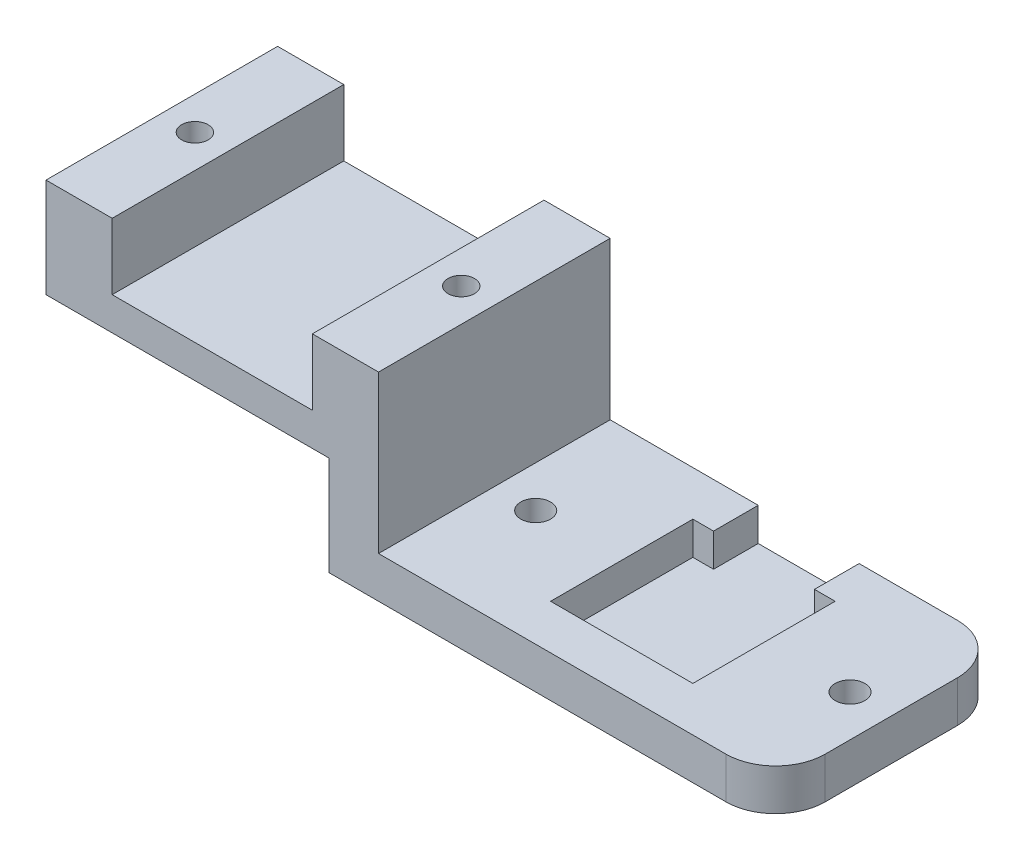
ISO-10303-21;
HEADER;
FILE_DESCRIPTION(('STEP AP214'),'2;1');
FILE_NAME('part.step','',(''),(''),'','','');
FILE_SCHEMA(('AUTOMOTIVE_DESIGN { 1 0 10303 214 1 1 1 1 }'));
ENDSEC;
DATA;
#1=APPLICATION_CONTEXT('core data for automotive mechanical design processes');
#2=APPLICATION_PROTOCOL_DEFINITION('international standard','automotive_design',2000,#1);
#3=PRODUCT_CONTEXT('',#1,'mechanical');
#4=PRODUCT('Part','Part','',(#3));
#5=PRODUCT_RELATED_PRODUCT_CATEGORY('part','',(#4));
#6=PRODUCT_DEFINITION_FORMATION('','',#4);
#7=PRODUCT_DEFINITION_CONTEXT('part definition',#1,'design');
#8=PRODUCT_DEFINITION('design','',#6,#7);
#9=PRODUCT_DEFINITION_SHAPE('','',#8);
#10=(LENGTH_UNIT() NAMED_UNIT(*) SI_UNIT(.MILLI.,.METRE.));
#11=(NAMED_UNIT(*) PLANE_ANGLE_UNIT() SI_UNIT($,.RADIAN.));
#12=(NAMED_UNIT(*) SI_UNIT($,.STERADIAN.) SOLID_ANGLE_UNIT());
#13=UNCERTAINTY_MEASURE_WITH_UNIT(LENGTH_MEASURE(1.E-05),#10,'distance_accuracy_value','');
#14=(GEOMETRIC_REPRESENTATION_CONTEXT(3) GLOBAL_UNCERTAINTY_ASSIGNED_CONTEXT((#13)) GLOBAL_UNIT_ASSIGNED_CONTEXT((#10,
#11,#12)) REPRESENTATION_CONTEXT('',''));
#15=CARTESIAN_POINT('',(0.,0.,0.));
#16=DIRECTION('',(0.,0.,1.));
#17=DIRECTION('',(1.,0.,0.));
#18=AXIS2_PLACEMENT_3D('',#15,#16,#17);
#19=CARTESIAN_POINT('',(10.05,6.,-7.));
#20=DIRECTION('',(-1.,0.,0.));
#21=DIRECTION('',(0.,0.,1.));
#22=AXIS2_PLACEMENT_3D('',#19,#20,#21);
#23=PLANE('',#22);
#24=DIRECTION('',(0.,0.,1.));
#25=VECTOR('',#24,1.);
#26=CARTESIAN_POINT('',(10.05,-3.5,7.));
#27=LINE('',#26,#25);
#28=CARTESIAN_POINT('',(10.05,-3.5,-7.));
#29=VERTEX_POINT('',#28);
#30=CARTESIAN_POINT('',(10.05,-3.5,7.));
#31=VERTEX_POINT('',#30);
#32=EDGE_CURVE('E301',#29,#31,#27,.T.);
#33=ORIENTED_EDGE('',*,*,#32,.F.);
#34=DIRECTION('',(0.,-1.,0.));
#35=VECTOR('',#34,1.);
#36=CARTESIAN_POINT('',(10.05,6.,-7.));
#37=LINE('',#36,#35);
#38=CARTESIAN_POINT('',(10.05,6.,-7.));
#39=VERTEX_POINT('',#38);
#40=EDGE_CURVE('E408',#39,#29,#37,.T.);
#41=ORIENTED_EDGE('',*,*,#40,.F.);
#42=DIRECTION('',(0.,0.,-1.));
#43=VECTOR('',#42,1.);
#44=CARTESIAN_POINT('',(10.05,6.,-7.));
#45=LINE('',#44,#43);
#46=CARTESIAN_POINT('',(10.05,6.,7.));
#47=VERTEX_POINT('',#46);
#48=EDGE_CURVE('E380',#47,#39,#45,.T.);
#49=ORIENTED_EDGE('',*,*,#48,.F.);
#50=DIRECTION('',(0.,-1.,0.));
#51=VECTOR('',#50,1.);
#52=CARTESIAN_POINT('',(10.05,6.,7.));
#53=LINE('',#52,#51);
#54=EDGE_CURVE('E394',#47,#31,#53,.T.);
#55=ORIENTED_EDGE('',*,*,#54,.T.);
#56=EDGE_LOOP('',(#33,#41,#49,#55));
#57=FACE_BOUND('',#56,.T.);
#58=ADVANCED_FACE('F42',(#57),#23,.F.);
#59=CARTESIAN_POINT('',(0.,0.,0.));
#60=DIRECTION('',(0.,1.,0.));
#61=DIRECTION('',(0.,0.,1.));
#62=AXIS2_PLACEMENT_3D('',#59,#60,#61);
#63=PLANE('',#62);
#64=CARTESIAN_POINT('',(-8.05,0.,0.));
#65=DIRECTION('',(0.,1.,0.));
#66=DIRECTION('',(0.,0.,1.));
#67=AXIS2_PLACEMENT_3D('',#64,#65,#66);
#68=CIRCLE('',#67,0.799999999999988);
#69=CARTESIAN_POINT('',(-8.05,0.,0.799999999999987));
#70=VERTEX_POINT('',#69);
#71=EDGE_CURVE('E227',#70,#70,#68,.T.);
#72=ORIENTED_EDGE('',*,*,#71,.T.);
#73=EDGE_LOOP('',(#72));
#74=FACE_BOUND('',#73,.T.);
#75=DIRECTION('',(1.,0.,0.));
#76=VECTOR('',#75,1.);
#77=CARTESIAN_POINT('',(0.,0.,-3.));
#78=LINE('',#77,#76);
#79=CARTESIAN_POINT('',(0.,0.,-3.));
#80=VERTEX_POINT('',#79);
#81=CARTESIAN_POINT('',(7.04999999999999,0.,-3.));
#82=VERTEX_POINT('',#81);
#83=EDGE_CURVE('E321',#80,#82,#78,.T.);
#84=ORIENTED_EDGE('',*,*,#83,.F.);
#85=DIRECTION('',(0.,0.,1.));
#86=VECTOR('',#85,1.);
#87=CARTESIAN_POINT('',(0.,0.,-3.));
#88=LINE('',#87,#86);
#89=CARTESIAN_POINT('',(0.,0.,-1.));
#90=VERTEX_POINT('',#89);
#91=EDGE_CURVE('E323',#80,#90,#88,.T.);
#92=ORIENTED_EDGE('',*,*,#91,.T.);
#93=DIRECTION('',(1.,0.,0.));
#94=VECTOR('',#93,1.);
#95=CARTESIAN_POINT('',(0.,0.,-1.));
#96=LINE('',#95,#94);
#97=CARTESIAN_POINT('',(7.04999999999999,0.,-1.));
#98=VERTEX_POINT('',#97);
#99=EDGE_CURVE('E319',#90,#98,#96,.T.);
#100=ORIENTED_EDGE('',*,*,#99,.T.);
#101=DIRECTION('',(0.,0.,-1.));
#102=VECTOR('',#101,1.);
#103=CARTESIAN_POINT('',(7.04999999999999,0.,7.));
#104=LINE('',#103,#102);
#105=CARTESIAN_POINT('',(7.04999999999999,0.,7.));
#106=VERTEX_POINT('',#105);
#107=EDGE_CURVE('E345',#106,#98,#104,.T.);
#108=ORIENTED_EDGE('',*,*,#107,.F.);
#109=DIRECTION('',(1.,0.,0.));
#110=VECTOR('',#109,1.);
#111=CARTESIAN_POINT('',(-10.05,0.,7.));
#112=LINE('',#111,#110);
#113=CARTESIAN_POINT('',(-10.05,0.,7.));
#114=VERTEX_POINT('',#113);
#115=EDGE_CURVE('E384',#114,#106,#112,.T.);
#116=ORIENTED_EDGE('',*,*,#115,.F.);
#117=DIRECTION('',(0.,0.,1.));
#118=VECTOR('',#117,1.);
#119=CARTESIAN_POINT('',(-10.05,0.,-7.));
#120=LINE('',#119,#118);
#121=CARTESIAN_POINT('',(-10.05,0.,-7.));
#122=VERTEX_POINT('',#121);
#123=EDGE_CURVE('E396',#122,#114,#120,.T.);
#124=ORIENTED_EDGE('',*,*,#123,.F.);
#125=DIRECTION('',(-1.,0.,0.));
#126=VECTOR('',#125,1.);
#127=CARTESIAN_POINT('',(-10.05,0.,-7.));
#128=LINE('',#127,#126);
#129=CARTESIAN_POINT('',(7.04999999999999,0.,-7.));
#130=VERTEX_POINT('',#129);
#131=EDGE_CURVE('E373',#130,#122,#128,.T.);
#132=ORIENTED_EDGE('',*,*,#131,.F.);
#133=EDGE_CURVE('E335',#82,#130,#104,.T.);
#134=ORIENTED_EDGE('',*,*,#133,.F.);
#135=EDGE_LOOP('',(#84,#92,#100,#108,#116,#124,#132,#134));
#136=FACE_BOUND('',#135,.T.);
#137=ADVANCED_FACE('F486',(#74,#136),#63,.F.);
#138=CARTESIAN_POINT('',(7.04999999999999,-6.,7.));
#139=DIRECTION('',(1.,0.,0.));
#140=DIRECTION('',(0.,0.,-1.));
#141=AXIS2_PLACEMENT_3D('',#138,#139,#140);
#142=PLANE('',#141);
#143=DIRECTION('',(0.,-1.,0.));
#144=VECTOR('',#143,1.);
#145=CARTESIAN_POINT('',(7.04999999999999,0.,-3.));
#146=LINE('',#145,#144);
#147=CARTESIAN_POINT('',(7.04999999999999,-6.,-3.));
#148=VERTEX_POINT('',#147);
#149=EDGE_CURVE('E316',#82,#148,#146,.T.);
#150=ORIENTED_EDGE('',*,*,#149,.F.);
#151=ORIENTED_EDGE('',*,*,#133,.T.);
#152=DIRECTION('',(0.,1.,0.));
#153=VECTOR('',#152,1.);
#154=CARTESIAN_POINT('',(7.04999999999999,-6.,-7.));
#155=LINE('',#154,#153);
#156=CARTESIAN_POINT('',(7.04999999999999,-6.,-7.));
#157=VERTEX_POINT('',#156);
#158=EDGE_CURVE('E350',#157,#130,#155,.T.);
#159=ORIENTED_EDGE('',*,*,#158,.F.);
#160=DIRECTION('',(0.,0.,-1.));
#161=VECTOR('',#160,1.);
#162=CARTESIAN_POINT('',(7.04999999999999,-6.,7.));
#163=LINE('',#162,#161);
#164=EDGE_CURVE('E340',#148,#157,#163,.T.);
#165=ORIENTED_EDGE('',*,*,#164,.F.);
#166=EDGE_LOOP('',(#150,#151,#159,#165));
#167=FACE_BOUND('',#166,.T.);
#168=ADVANCED_FACE('F498',(#167),#142,.F.);
#169=CARTESIAN_POINT('',(0.,6.,0.));
#170=DIRECTION('',(0.,1.,0.));
#171=DIRECTION('',(0.,0.,1.));
#172=AXIS2_PLACEMENT_3D('',#169,#170,#171);
#173=PLANE('',#172);
#174=CARTESIAN_POINT('',(-8.05,6.,0.));
#175=DIRECTION('',(0.,1.,0.));
#176=DIRECTION('',(0.,0.,1.));
#177=AXIS2_PLACEMENT_3D('',#174,#175,#176);
#178=CIRCLE('',#177,0.79999999999999);
#179=CARTESIAN_POINT('',(-8.05,6.,0.799999999999989));
#180=VERTEX_POINT('',#179);
#181=EDGE_CURVE('E888',#180,#180,#178,.T.);
#182=ORIENTED_EDGE('',*,*,#181,.F.);
#183=EDGE_LOOP('',(#182));
#184=FACE_BOUND('',#183,.T.);
#185=DIRECTION('',(0.,0.,1.));
#186=VECTOR('',#185,1.);
#187=CARTESIAN_POINT('',(-6.05,6.,-7.));
#188=LINE('',#187,#186);
#189=CARTESIAN_POINT('',(-6.05,6.,-7.));
#190=VERTEX_POINT('',#189);
#191=CARTESIAN_POINT('',(-6.05,6.,7.));
#192=VERTEX_POINT('',#191);
#193=EDGE_CURVE('E371',#190,#192,#188,.T.);
#194=ORIENTED_EDGE('',*,*,#193,.F.);
#195=DIRECTION('',(-1.,0.,0.));
#196=VECTOR('',#195,1.);
#197=CARTESIAN_POINT('',(-10.05,6.,-7.));
#198=LINE('',#197,#196);
#199=CARTESIAN_POINT('',(-10.05,6.,-7.));
#200=VERTEX_POINT('',#199);
#201=EDGE_CURVE('E383',#190,#200,#198,.T.);
#202=ORIENTED_EDGE('',*,*,#201,.T.);
#203=DIRECTION('',(0.,0.,1.));
#204=VECTOR('',#203,1.);
#205=CARTESIAN_POINT('',(-10.05,6.,-7.));
#206=LINE('',#205,#204);
#207=CARTESIAN_POINT('',(-10.05,6.,7.));
#208=VERTEX_POINT('',#207);
#209=EDGE_CURVE('E388',#200,#208,#206,.T.);
#210=ORIENTED_EDGE('',*,*,#209,.T.);
#211=DIRECTION('',(1.,0.,0.));
#212=VECTOR('',#211,1.);
#213=CARTESIAN_POINT('',(-10.05,6.,7.));
#214=LINE('',#213,#212);
#215=EDGE_CURVE('E391',#208,#192,#214,.T.);
#216=ORIENTED_EDGE('',*,*,#215,.T.);
#217=EDGE_LOOP('',(#194,#202,#210,#216));
#218=FACE_BOUND('',#217,.T.);
#219=ADVANCED_FACE('F512',(#184,#218),#173,.T.);
#220=CARTESIAN_POINT('',(-10.05,6.,-7.));
#221=DIRECTION('',(0.,0.,1.));
#222=DIRECTION('',(1.,0.,0.));
#223=AXIS2_PLACEMENT_3D('',#220,#221,#222);
#224=PLANE('',#223);
#225=DIRECTION('',(-1.,0.,0.));
#226=VECTOR('',#225,1.);
#227=CARTESIAN_POINT('',(34.05,-3.5,-7.));
#228=LINE('',#227,#226);
#229=CARTESIAN_POINT('',(31.05,-3.5,-7.));
#230=VERTEX_POINT('',#229);
#231=CARTESIAN_POINT('',(25.1,-3.5,-7.));
#232=VERTEX_POINT('',#231);
#233=EDGE_CURVE('E313',#230,#232,#228,.T.);
#234=ORIENTED_EDGE('',*,*,#233,.F.);
#235=DIRECTION('',(0.,1.,0.));
#236=VECTOR('',#235,1.);
#237=CARTESIAN_POINT('',(31.05,6.,-7.));
#238=LINE('',#237,#236);
#239=CARTESIAN_POINT('',(31.05,-6.,-7.));
#240=VERTEX_POINT('',#239);
#241=EDGE_CURVE('E65',#230,#240,#238,.F.);
#242=ORIENTED_EDGE('',*,*,#241,.T.);
#243=DIRECTION('',(1.,0.,0.));
#244=VECTOR('',#243,1.);
#245=CARTESIAN_POINT('',(7.04999999999999,-6.,-7.));
#246=LINE('',#245,#244);
#247=EDGE_CURVE('E339',#157,#240,#246,.T.);
#248=ORIENTED_EDGE('',*,*,#247,.F.);
#249=ORIENTED_EDGE('',*,*,#158,.T.);
#250=ORIENTED_EDGE('',*,*,#131,.T.);
#251=DIRECTION('',(0.,-1.,0.));
#252=VECTOR('',#251,1.);
#253=CARTESIAN_POINT('',(-10.05,6.,-7.));
#254=LINE('',#253,#252);
#255=EDGE_CURVE('E405',#200,#122,#254,.T.);
#256=ORIENTED_EDGE('',*,*,#255,.F.);
#257=ORIENTED_EDGE('',*,*,#201,.F.);
#258=DIRECTION('',(0.,-1.,0.));
#259=VECTOR('',#258,1.);
#260=CARTESIAN_POINT('',(-6.05,6.,-7.));
#261=LINE('',#260,#259);
#262=CARTESIAN_POINT('',(-6.05,2.,-7.));
#263=VERTEX_POINT('',#262);
#264=EDGE_CURVE('E354',#190,#263,#261,.T.);
#265=ORIENTED_EDGE('',*,*,#264,.T.);
#266=DIRECTION('',(1.,0.,0.));
#267=VECTOR('',#266,1.);
#268=CARTESIAN_POINT('',(-6.05,2.,-7.));
#269=LINE('',#268,#267);
#270=CARTESIAN_POINT('',(6.05,2.,-7.));
#271=VERTEX_POINT('',#270);
#272=EDGE_CURVE('E357',#263,#271,#269,.T.);
#273=ORIENTED_EDGE('',*,*,#272,.T.);
#274=DIRECTION('',(0.,1.,0.));
#275=VECTOR('',#274,1.);
#276=CARTESIAN_POINT('',(6.05,6.,-7.));
#277=LINE('',#276,#275);
#278=CARTESIAN_POINT('',(6.05,6.,-7.));
#279=VERTEX_POINT('',#278);
#280=EDGE_CURVE('E361',#271,#279,#277,.T.);
#281=ORIENTED_EDGE('',*,*,#280,.T.);
#282=EDGE_CURVE('E385',#39,#279,#198,.T.);
#283=ORIENTED_EDGE('',*,*,#282,.F.);
#284=ORIENTED_EDGE('',*,*,#40,.T.);
#285=CARTESIAN_POINT('',(19.,-3.5,-7.));
#286=VERTEX_POINT('',#285);
#287=EDGE_CURVE('E312',#286,#29,#228,.T.);
#288=ORIENTED_EDGE('',*,*,#287,.F.);
#289=DIRECTION('',(0.,1.,0.));
#290=VECTOR('',#289,1.);
#291=CARTESIAN_POINT('',(19.,-20.2003521083106,-7.));
#292=LINE('',#291,#290);
#293=CARTESIAN_POINT('',(19.,-5.5,-7.));
#294=VERTEX_POINT('',#293);
#295=EDGE_CURVE('E283',#294,#286,#292,.T.);
#296=ORIENTED_EDGE('',*,*,#295,.F.);
#297=DIRECTION('',(-1.,0.,0.));
#298=VECTOR('',#297,1.);
#299=CARTESIAN_POINT('',(19.,-5.5,-7.));
#300=LINE('',#299,#298);
#301=CARTESIAN_POINT('',(25.1,-5.5,-7.));
#302=VERTEX_POINT('',#301);
#303=EDGE_CURVE('E284',#302,#294,#300,.T.);
#304=ORIENTED_EDGE('',*,*,#303,.F.);
#305=DIRECTION('',(0.,1.,0.));
#306=VECTOR('',#305,1.);
#307=CARTESIAN_POINT('',(25.1,-20.2003521083106,-7.));
#308=LINE('',#307,#306);
#309=EDGE_CURVE('E287',#302,#232,#308,.T.);
#310=ORIENTED_EDGE('',*,*,#309,.T.);
#311=EDGE_LOOP('',(#234,#242,#248,#249,#250,#256,#257,#265,#273,#281,#283,#284,#288,#296,#304,#310));
#312=FACE_BOUND('',#311,.T.);
#313=ADVANCED_FACE('F434',(#312),#224,.F.);
#314=CARTESIAN_POINT('',(-10.05,6.,-7.));
#315=DIRECTION('',(1.,0.,0.));
#316=DIRECTION('',(0.,0.,-1.));
#317=AXIS2_PLACEMENT_3D('',#314,#315,#316);
#318=PLANE('',#317);
#319=ORIENTED_EDGE('',*,*,#123,.T.);
#320=DIRECTION('',(0.,-1.,0.));
#321=VECTOR('',#320,1.);
#322=CARTESIAN_POINT('',(-10.05,6.,7.));
#323=LINE('',#322,#321);
#324=EDGE_CURVE('E402',#208,#114,#323,.T.);
#325=ORIENTED_EDGE('',*,*,#324,.F.);
#326=ORIENTED_EDGE('',*,*,#209,.F.);
#327=ORIENTED_EDGE('',*,*,#255,.T.);
#328=EDGE_LOOP('',(#319,#325,#326,#327));
#329=FACE_BOUND('',#328,.T.);
#330=ADVANCED_FACE('F505',(#329),#318,.F.);
#331=CARTESIAN_POINT('',(-10.05,6.,7.));
#332=DIRECTION('',(0.,0.,-1.));
#333=DIRECTION('',(-1.,0.,0.));
#334=AXIS2_PLACEMENT_3D('',#331,#332,#333);
#335=PLANE('',#334);
#336=DIRECTION('',(-1.,0.,0.));
#337=VECTOR('',#336,1.);
#338=CARTESIAN_POINT('',(7.04999999999999,-6.,7.));
#339=LINE('',#338,#337);
#340=CARTESIAN_POINT('',(31.05,-6.,7.));
#341=VERTEX_POINT('',#340);
#342=CARTESIAN_POINT('',(7.04999999999999,-6.,7.));
#343=VERTEX_POINT('',#342);
#344=EDGE_CURVE('E342',#341,#343,#339,.T.);
#345=ORIENTED_EDGE('',*,*,#344,.F.);
#346=DIRECTION('',(0.,-1.,0.));
#347=VECTOR('',#346,1.);
#348=CARTESIAN_POINT('',(31.05,6.,7.));
#349=LINE('',#348,#347);
#350=CARTESIAN_POINT('',(31.05,-3.5,7.));
#351=VERTEX_POINT('',#350);
#352=EDGE_CURVE('E12',#341,#351,#349,.F.);
#353=ORIENTED_EDGE('',*,*,#352,.T.);
#354=DIRECTION('',(-1.,0.,0.));
#355=VECTOR('',#354,1.);
#356=CARTESIAN_POINT('',(34.05,-3.5,7.));
#357=LINE('',#356,#355);
#358=EDGE_CURVE('E308',#351,#31,#357,.T.);
#359=ORIENTED_EDGE('',*,*,#358,.T.);
#360=ORIENTED_EDGE('',*,*,#54,.F.);
#361=CARTESIAN_POINT('',(6.05,6.,7.));
#362=VERTEX_POINT('',#361);
#363=EDGE_CURVE('E390',#362,#47,#214,.T.);
#364=ORIENTED_EDGE('',*,*,#363,.F.);
#365=DIRECTION('',(0.,1.,0.));
#366=VECTOR('',#365,1.);
#367=CARTESIAN_POINT('',(6.05,6.,7.));
#368=LINE('',#367,#366);
#369=CARTESIAN_POINT('',(6.05,2.,7.));
#370=VERTEX_POINT('',#369);
#371=EDGE_CURVE('E358',#370,#362,#368,.T.);
#372=ORIENTED_EDGE('',*,*,#371,.F.);
#373=DIRECTION('',(1.,0.,0.));
#374=VECTOR('',#373,1.);
#375=CARTESIAN_POINT('',(-6.05,2.,7.));
#376=LINE('',#375,#374);
#377=CARTESIAN_POINT('',(-6.05,2.,7.));
#378=VERTEX_POINT('',#377);
#379=EDGE_CURVE('E367',#378,#370,#376,.T.);
#380=ORIENTED_EDGE('',*,*,#379,.F.);
#381=DIRECTION('',(0.,-1.,0.));
#382=VECTOR('',#381,1.);
#383=CARTESIAN_POINT('',(-6.05,6.,7.));
#384=LINE('',#383,#382);
#385=EDGE_CURVE('E353',#192,#378,#384,.T.);
#386=ORIENTED_EDGE('',*,*,#385,.F.);
#387=ORIENTED_EDGE('',*,*,#215,.F.);
#388=ORIENTED_EDGE('',*,*,#324,.T.);
#389=ORIENTED_EDGE('',*,*,#115,.T.);
#390=DIRECTION('',(0.,1.,0.));
#391=VECTOR('',#390,1.);
#392=CARTESIAN_POINT('',(7.04999999999999,-6.,7.));
#393=LINE('',#392,#391);
#394=EDGE_CURVE('E344',#343,#106,#393,.T.);
#395=ORIENTED_EDGE('',*,*,#394,.F.);
#396=EDGE_LOOP('',(#345,#353,#359,#360,#364,#372,#380,#386,#387,#388,#389,#395));
#397=FACE_BOUND('',#396,.T.);
#398=ADVANCED_FACE('F475',(#397),#335,.F.);
#399=CARTESIAN_POINT('',(8.05,6.,0.));
#400=DIRECTION('',(0.,1.,0.));
#401=DIRECTION('',(0.,0.,1.));
#402=AXIS2_PLACEMENT_3D('',#399,#400,#401);
#403=CIRCLE('',#402,0.79999999999999);
#404=CARTESIAN_POINT('',(8.05,6.,0.799999999999989));
#405=VERTEX_POINT('',#404);
#406=EDGE_CURVE('E221',#405,#405,#403,.T.);
#407=ORIENTED_EDGE('',*,*,#406,.F.);
#408=EDGE_LOOP('',(#407));
#409=FACE_BOUND('',#408,.T.);
#410=DIRECTION('',(0.,0.,1.));
#411=VECTOR('',#410,1.);
#412=CARTESIAN_POINT('',(6.05,6.,-7.));
#413=LINE('',#412,#411);
#414=EDGE_CURVE('E374',#279,#362,#413,.T.);
#415=ORIENTED_EDGE('',*,*,#414,.T.);
#416=ORIENTED_EDGE('',*,*,#363,.T.);
#417=ORIENTED_EDGE('',*,*,#48,.T.);
#418=ORIENTED_EDGE('',*,*,#282,.T.);
#419=EDGE_LOOP('',(#415,#416,#417,#418));
#420=FACE_BOUND('',#419,.T.);
#421=ADVANCED_FACE('F523',(#409,#420),#173,.T.);
#422=CARTESIAN_POINT('',(-6.05,6.,-7.));
#423=DIRECTION('',(-1.,0.,0.));
#424=DIRECTION('',(0.,0.,1.));
#425=AXIS2_PLACEMENT_3D('',#422,#423,#424);
#426=PLANE('',#425);
#427=ORIENTED_EDGE('',*,*,#385,.T.);
#428=DIRECTION('',(0.,0.,1.));
#429=VECTOR('',#428,1.);
#430=CARTESIAN_POINT('',(-6.05,2.,-7.));
#431=LINE('',#430,#429);
#432=EDGE_CURVE('E364',#263,#378,#431,.T.);
#433=ORIENTED_EDGE('',*,*,#432,.F.);
#434=ORIENTED_EDGE('',*,*,#264,.F.);
#435=ORIENTED_EDGE('',*,*,#193,.T.);
#436=EDGE_LOOP('',(#427,#433,#434,#435));
#437=FACE_BOUND('',#436,.T.);
#438=ADVANCED_FACE('F515',(#437),#426,.F.);
#439=CARTESIAN_POINT('',(6.05,6.,-7.));
#440=DIRECTION('',(1.,0.,0.));
#441=DIRECTION('',(0.,0.,-1.));
#442=AXIS2_PLACEMENT_3D('',#439,#440,#441);
#443=PLANE('',#442);
#444=ORIENTED_EDGE('',*,*,#371,.T.);
#445=ORIENTED_EDGE('',*,*,#414,.F.);
#446=ORIENTED_EDGE('',*,*,#280,.F.);
#447=DIRECTION('',(0.,0.,1.));
#448=VECTOR('',#447,1.);
#449=CARTESIAN_POINT('',(6.05,2.,-7.));
#450=LINE('',#449,#448);
#451=EDGE_CURVE('E377',#271,#370,#450,.T.);
#452=ORIENTED_EDGE('',*,*,#451,.T.);
#453=EDGE_LOOP('',(#444,#445,#446,#452));
#454=FACE_BOUND('',#453,.T.);
#455=ADVANCED_FACE('F521',(#454),#443,.F.);
#456=CARTESIAN_POINT('',(-6.05,2.,-7.));
#457=DIRECTION('',(0.,-1.,0.));
#458=DIRECTION('',(0.,0.,-1.));
#459=AXIS2_PLACEMENT_3D('',#456,#457,#458);
#460=PLANE('',#459);
#461=ORIENTED_EDGE('',*,*,#379,.T.);
#462=ORIENTED_EDGE('',*,*,#451,.F.);
#463=ORIENTED_EDGE('',*,*,#272,.F.);
#464=ORIENTED_EDGE('',*,*,#432,.T.);
#465=EDGE_LOOP('',(#461,#462,#463,#464));
#466=FACE_BOUND('',#465,.T.);
#467=ADVANCED_FACE('F517',(#466),#460,.F.);
#468=ORIENTED_EDGE('',*,*,#107,.T.);
#469=DIRECTION('',(0.,-1.,0.));
#470=VECTOR('',#469,1.);
#471=CARTESIAN_POINT('',(7.04999999999999,0.,-1.));
#472=LINE('',#471,#470);
#473=CARTESIAN_POINT('',(7.04999999999999,-6.,-1.));
#474=VERTEX_POINT('',#473);
#475=EDGE_CURVE('E315',#98,#474,#472,.T.);
#476=ORIENTED_EDGE('',*,*,#475,.T.);
#477=EDGE_CURVE('E336',#343,#474,#163,.T.);
#478=ORIENTED_EDGE('',*,*,#477,.F.);
#479=ORIENTED_EDGE('',*,*,#394,.T.);
#480=EDGE_LOOP('',(#468,#476,#478,#479));
#481=FACE_BOUND('',#480,.T.);
#482=ADVANCED_FACE('F480',(#481),#142,.F.);
#483=CARTESIAN_POINT('',(0.,-6.,0.));
#484=DIRECTION('',(0.,-1.,0.));
#485=DIRECTION('',(0.,0.,-1.));
#486=AXIS2_PLACEMENT_3D('',#483,#484,#485);
#487=PLANE('',#486);
#488=CARTESIAN_POINT('',(12.55,-6.,0.));
#489=DIRECTION('',(0.,1.,0.));
#490=DIRECTION('',(0.,0.,1.));
#491=AXIS2_PLACEMENT_3D('',#488,#489,#490);
#492=CIRCLE('',#491,0.9);
#493=CARTESIAN_POINT('',(12.55,-6.,0.9));
#494=VERTEX_POINT('',#493);
#495=EDGE_CURVE('E231',#494,#494,#492,.T.);
#496=ORIENTED_EDGE('',*,*,#495,.T.);
#497=EDGE_LOOP('',(#496));
#498=FACE_BOUND('',#497,.T.);
#499=CARTESIAN_POINT('',(31.55,-6.,0.));
#500=DIRECTION('',(0.,1.,0.));
#501=DIRECTION('',(0.,0.,1.));
#502=AXIS2_PLACEMENT_3D('',#499,#500,#501);
#503=CIRCLE('',#502,0.899999999999997);
#504=CARTESIAN_POINT('',(31.55,-6.,0.899999999999997));
#505=VERTEX_POINT('',#504);
#506=EDGE_CURVE('E220',#505,#505,#503,.T.);
#507=ORIENTED_EDGE('',*,*,#506,.T.);
#508=EDGE_LOOP('',(#507));
#509=FACE_BOUND('',#508,.T.);
#510=ORIENTED_EDGE('',*,*,#247,.T.);
#511=CARTESIAN_POINT('',(31.05,-6.,-4.));
#512=DIRECTION('',(0.,-1.,0.));
#513=DIRECTION('',(0.,0.,-1.));
#514=AXIS2_PLACEMENT_3D('',#511,#512,#513);
#515=CIRCLE('',#514,3.);
#516=CARTESIAN_POINT('',(34.05,-6.,-4.));
#517=VERTEX_POINT('',#516);
#518=EDGE_CURVE('E50',#240,#517,#515,.T.);
#519=ORIENTED_EDGE('',*,*,#518,.T.);
#520=DIRECTION('',(0.,0.,-1.));
#521=VECTOR('',#520,1.);
#522=CARTESIAN_POINT('',(34.05,-6.,7.));
#523=LINE('',#522,#521);
#524=CARTESIAN_POINT('',(34.05,-6.,4.));
#525=VERTEX_POINT('',#524);
#526=EDGE_CURVE('E302',#525,#517,#523,.T.);
#527=ORIENTED_EDGE('',*,*,#526,.F.);
#528=CARTESIAN_POINT('',(31.05,-6.,4.));
#529=DIRECTION('',(0.,-1.,0.));
#530=DIRECTION('',(0.,0.,-1.));
#531=AXIS2_PLACEMENT_3D('',#528,#529,#530);
#532=CIRCLE('',#531,3.);
#533=EDGE_CURVE('E57',#525,#341,#532,.T.);
#534=ORIENTED_EDGE('',*,*,#533,.T.);
#535=ORIENTED_EDGE('',*,*,#344,.T.);
#536=ORIENTED_EDGE('',*,*,#477,.T.);
#537=DIRECTION('',(0.,0.,1.));
#538=VECTOR('',#537,1.);
#539=CARTESIAN_POINT('',(7.04999999999999,-6.,-3.));
#540=LINE('',#539,#538);
#541=EDGE_CURVE('E332',#148,#474,#540,.T.);
#542=ORIENTED_EDGE('',*,*,#541,.F.);
#543=ORIENTED_EDGE('',*,*,#164,.T.);
#544=EDGE_LOOP('',(#510,#519,#527,#534,#535,#536,#542,#543));
#545=FACE_BOUND('',#544,.T.);
#546=ADVANCED_FACE('F423',(#498,#509,#545),#487,.T.);
#547=CARTESIAN_POINT('',(7.04999999999999,-6.,-3.));
#548=DIRECTION('',(0.648118629528358,0.76153938969582,0.));
#549=DIRECTION('',(-0.76153938969582,0.648118629528358,0.));
#550=AXIS2_PLACEMENT_3D('',#547,#548,#549);
#551=PLANE('',#550);
#552=DIRECTION('',(-0.76153938969582,0.648118629528358,0.));
#553=VECTOR('',#552,1.);
#554=CARTESIAN_POINT('',(7.04999999999999,-6.,-1.));
#555=LINE('',#554,#553);
#556=EDGE_CURVE('E326',#474,#90,#555,.T.);
#557=ORIENTED_EDGE('',*,*,#556,.T.);
#558=ORIENTED_EDGE('',*,*,#91,.F.);
#559=DIRECTION('',(-0.76153938969582,0.648118629528358,0.));
#560=VECTOR('',#559,1.);
#561=CARTESIAN_POINT('',(7.04999999999999,-6.,-3.));
#562=LINE('',#561,#560);
#563=EDGE_CURVE('E318',#148,#80,#562,.T.);
#564=ORIENTED_EDGE('',*,*,#563,.F.);
#565=ORIENTED_EDGE('',*,*,#541,.T.);
#566=EDGE_LOOP('',(#557,#558,#564,#565));
#567=FACE_BOUND('',#566,.T.);
#568=ADVANCED_FACE('F492',(#567),#551,.F.);
#569=CARTESIAN_POINT('',(0.,0.,-3.));
#570=DIRECTION('',(0.,0.,1.));
#571=DIRECTION('',(1.,0.,0.));
#572=AXIS2_PLACEMENT_3D('',#569,#570,#571);
#573=PLANE('',#572);
#574=ORIENTED_EDGE('',*,*,#149,.T.);
#575=ORIENTED_EDGE('',*,*,#563,.T.);
#576=ORIENTED_EDGE('',*,*,#83,.T.);
#577=EDGE_LOOP('',(#574,#575,#576));
#578=FACE_BOUND('',#577,.T.);
#579=ADVANCED_FACE('F586',(#578),#573,.F.);
#580=CARTESIAN_POINT('',(0.,0.,-1.));
#581=DIRECTION('',(0.,0.,1.));
#582=DIRECTION('',(1.,0.,0.));
#583=AXIS2_PLACEMENT_3D('',#580,#581,#582);
#584=PLANE('',#583);
#585=ORIENTED_EDGE('',*,*,#475,.F.);
#586=ORIENTED_EDGE('',*,*,#99,.F.);
#587=ORIENTED_EDGE('',*,*,#556,.F.);
#588=EDGE_LOOP('',(#585,#586,#587));
#589=FACE_BOUND('',#588,.T.);
#590=ADVANCED_FACE('F483',(#589),#584,.T.);
#591=CARTESIAN_POINT('',(34.05,-3.5,7.));
#592=DIRECTION('',(0.,-1.,0.));
#593=DIRECTION('',(0.,0.,-1.));
#594=AXIS2_PLACEMENT_3D('',#591,#592,#593);
#595=PLANE('',#594);
#596=CARTESIAN_POINT('',(12.55,-3.5,0.));
#597=DIRECTION('',(0.,1.,0.));
#598=DIRECTION('',(0.,0.,1.));
#599=AXIS2_PLACEMENT_3D('',#596,#597,#598);
#600=CIRCLE('',#599,0.9);
#601=CARTESIAN_POINT('',(12.55,-3.5,0.9));
#602=VERTEX_POINT('',#601);
#603=EDGE_CURVE('E235',#602,#602,#600,.T.);
#604=ORIENTED_EDGE('',*,*,#603,.F.);
#605=EDGE_LOOP('',(#604));
#606=FACE_BOUND('',#605,.T.);
#607=CARTESIAN_POINT('',(31.55,-3.5,0.));
#608=DIRECTION('',(0.,1.,0.));
#609=DIRECTION('',(0.,0.,1.));
#610=AXIS2_PLACEMENT_3D('',#607,#608,#609);
#611=CIRCLE('',#610,0.899999999999997);
#612=CARTESIAN_POINT('',(31.55,-3.5,0.899999999999997));
#613=VERTEX_POINT('',#612);
#614=EDGE_CURVE('E224',#613,#613,#611,.T.);
#615=ORIENTED_EDGE('',*,*,#614,.F.);
#616=EDGE_LOOP('',(#615));
#617=FACE_BOUND('',#616,.T.);
#618=DIRECTION('',(0.,0.,1.));
#619=VECTOR('',#618,1.);
#620=CARTESIAN_POINT('',(34.05,-3.5,7.));
#621=LINE('',#620,#619);
#622=CARTESIAN_POINT('',(34.05,-3.5,-4.));
#623=VERTEX_POINT('',#622);
#624=CARTESIAN_POINT('',(34.05,-3.5,4.));
#625=VERTEX_POINT('',#624);
#626=EDGE_CURVE('E305',#623,#625,#621,.T.);
#627=ORIENTED_EDGE('',*,*,#626,.F.);
#628=CARTESIAN_POINT('',(31.05,-3.5,-4.));
#629=DIRECTION('',(0.,-1.,0.));
#630=DIRECTION('',(0.,0.,-1.));
#631=AXIS2_PLACEMENT_3D('',#628,#629,#630);
#632=CIRCLE('',#631,3.);
#633=EDGE_CURVE('E419',#623,#230,#632,.F.);
#634=ORIENTED_EDGE('',*,*,#633,.T.);
#635=ORIENTED_EDGE('',*,*,#233,.T.);
#636=DIRECTION('',(0.,0.,-1.));
#637=VECTOR('',#636,1.);
#638=CARTESIAN_POINT('',(25.1,-3.5,-7.));
#639=LINE('',#638,#637);
#640=CARTESIAN_POINT('',(25.1,-3.5,-4.3));
#641=VERTEX_POINT('',#640);
#642=EDGE_CURVE('E252',#641,#232,#639,.T.);
#643=ORIENTED_EDGE('',*,*,#642,.F.);
#644=DIRECTION('',(-1.,0.,0.));
#645=VECTOR('',#644,1.);
#646=CARTESIAN_POINT('',(25.1,-3.5,-4.3));
#647=LINE('',#646,#645);
#648=CARTESIAN_POINT('',(26.35,-3.5,-4.3));
#649=VERTEX_POINT('',#648);
#650=EDGE_CURVE('E255',#649,#641,#647,.T.);
#651=ORIENTED_EDGE('',*,*,#650,.F.);
#652=DIRECTION('',(0.,0.,-1.));
#653=VECTOR('',#652,1.);
#654=CARTESIAN_POINT('',(26.35,-3.5,-4.3));
#655=LINE('',#654,#653);
#656=CARTESIAN_POINT('',(26.35,-3.5,4.3));
#657=VERTEX_POINT('',#656);
#658=EDGE_CURVE('E234',#657,#649,#655,.T.);
#659=ORIENTED_EDGE('',*,*,#658,.F.);
#660=DIRECTION('',(1.,0.,0.));
#661=VECTOR('',#660,1.);
#662=CARTESIAN_POINT('',(17.75,-3.5,4.3));
#663=LINE('',#662,#661);
#664=CARTESIAN_POINT('',(17.75,-3.5,4.3));
#665=VERTEX_POINT('',#664);
#666=EDGE_CURVE('E240',#665,#657,#663,.T.);
#667=ORIENTED_EDGE('',*,*,#666,.F.);
#668=DIRECTION('',(0.,0.,1.));
#669=VECTOR('',#668,1.);
#670=CARTESIAN_POINT('',(17.75,-3.5,-4.3));
#671=LINE('',#670,#669);
#672=CARTESIAN_POINT('',(17.75,-3.5,-4.3));
#673=VERTEX_POINT('',#672);
#674=EDGE_CURVE('E243',#673,#665,#671,.T.);
#675=ORIENTED_EDGE('',*,*,#674,.F.);
#676=DIRECTION('',(-1.,0.,0.));
#677=VECTOR('',#676,1.);
#678=CARTESIAN_POINT('',(17.75,-3.5,-4.3));
#679=LINE('',#678,#677);
#680=CARTESIAN_POINT('',(19.,-3.5,-4.3));
#681=VERTEX_POINT('',#680);
#682=EDGE_CURVE('E246',#681,#673,#679,.T.);
#683=ORIENTED_EDGE('',*,*,#682,.F.);
#684=DIRECTION('',(0.,0.,1.));
#685=VECTOR('',#684,1.);
#686=CARTESIAN_POINT('',(19.,-3.5,-4.3));
#687=LINE('',#686,#685);
#688=EDGE_CURVE('E249',#286,#681,#687,.T.);
#689=ORIENTED_EDGE('',*,*,#688,.F.);
#690=ORIENTED_EDGE('',*,*,#287,.T.);
#691=ORIENTED_EDGE('',*,*,#32,.T.);
#692=ORIENTED_EDGE('',*,*,#358,.F.);
#693=CARTESIAN_POINT('',(31.05,-3.5,4.));
#694=DIRECTION('',(0.,-1.,0.));
#695=DIRECTION('',(0.,0.,-1.));
#696=AXIS2_PLACEMENT_3D('',#693,#694,#695);
#697=CIRCLE('',#696,3.);
#698=EDGE_CURVE('E417',#351,#625,#697,.F.);
#699=ORIENTED_EDGE('',*,*,#698,.T.);
#700=EDGE_LOOP('',(#627,#634,#635,#643,#651,#659,#667,#675,#683,#689,#690,#691,#692,#699));
#701=FACE_BOUND('',#700,.T.);
#702=ADVANCED_FACE('F432',(#606,#617,#701),#595,.F.);
#703=CARTESIAN_POINT('',(34.05,0.,0.));
#704=DIRECTION('',(-1.,0.,0.));
#705=DIRECTION('',(0.,0.,1.));
#706=AXIS2_PLACEMENT_3D('',#703,#704,#705);
#707=PLANE('',#706);
#708=ORIENTED_EDGE('',*,*,#526,.T.);
#709=DIRECTION('',(0.,1.,0.));
#710=VECTOR('',#709,1.);
#711=CARTESIAN_POINT('',(34.05,0.,-4.));
#712=LINE('',#711,#710);
#713=EDGE_CURVE('E414',#517,#623,#712,.T.);
#714=ORIENTED_EDGE('',*,*,#713,.T.);
#715=ORIENTED_EDGE('',*,*,#626,.T.);
#716=DIRECTION('',(0.,-1.,0.));
#717=VECTOR('',#716,1.);
#718=CARTESIAN_POINT('',(34.05,0.,4.));
#719=LINE('',#718,#717);
#720=EDGE_CURVE('E411',#625,#525,#719,.T.);
#721=ORIENTED_EDGE('',*,*,#720,.T.);
#722=EDGE_LOOP('',(#708,#714,#715,#721));
#723=FACE_BOUND('',#722,.T.);
#724=ADVANCED_FACE('F427',(#723),#707,.F.);
#725=CARTESIAN_POINT('',(0.,-5.5,0.));
#726=DIRECTION('',(0.,-1.,0.));
#727=DIRECTION('',(0.,0.,-1.));
#728=AXIS2_PLACEMENT_3D('',#725,#726,#727);
#729=PLANE('',#728);
#730=DIRECTION('',(0.,0.,-1.));
#731=VECTOR('',#730,1.);
#732=CARTESIAN_POINT('',(26.35,-5.5,-4.3));
#733=LINE('',#732,#731);
#734=CARTESIAN_POINT('',(26.35,-5.5,4.3));
#735=VERTEX_POINT('',#734);
#736=CARTESIAN_POINT('',(26.35,-5.5,-4.3));
#737=VERTEX_POINT('',#736);
#738=EDGE_CURVE('E263',#735,#737,#733,.T.);
#739=ORIENTED_EDGE('',*,*,#738,.T.);
#740=DIRECTION('',(-1.,0.,0.));
#741=VECTOR('',#740,1.);
#742=CARTESIAN_POINT('',(25.1,-5.5,-4.3));
#743=LINE('',#742,#741);
#744=CARTESIAN_POINT('',(25.1,-5.5,-4.3));
#745=VERTEX_POINT('',#744);
#746=EDGE_CURVE('E242',#737,#745,#743,.T.);
#747=ORIENTED_EDGE('',*,*,#746,.T.);
#748=DIRECTION('',(0.,0.,-1.));
#749=VECTOR('',#748,1.);
#750=CARTESIAN_POINT('',(25.1,-5.5,-7.));
#751=LINE('',#750,#749);
#752=EDGE_CURVE('E288',#745,#302,#751,.T.);
#753=ORIENTED_EDGE('',*,*,#752,.T.);
#754=ORIENTED_EDGE('',*,*,#303,.T.);
#755=DIRECTION('',(0.,0.,1.));
#756=VECTOR('',#755,1.);
#757=CARTESIAN_POINT('',(19.,-5.5,-4.3));
#758=LINE('',#757,#756);
#759=CARTESIAN_POINT('',(19.,-5.5,-4.3));
#760=VERTEX_POINT('',#759);
#761=EDGE_CURVE('E280',#294,#760,#758,.T.);
#762=ORIENTED_EDGE('',*,*,#761,.T.);
#763=DIRECTION('',(-1.,0.,0.));
#764=VECTOR('',#763,1.);
#765=CARTESIAN_POINT('',(17.75,-5.5,-4.3));
#766=LINE('',#765,#764);
#767=CARTESIAN_POINT('',(17.75,-5.5,-4.3));
#768=VERTEX_POINT('',#767);
#769=EDGE_CURVE('E276',#760,#768,#766,.T.);
#770=ORIENTED_EDGE('',*,*,#769,.T.);
#771=DIRECTION('',(0.,0.,1.));
#772=VECTOR('',#771,1.);
#773=CARTESIAN_POINT('',(17.75,-5.5,-4.3));
#774=LINE('',#773,#772);
#775=CARTESIAN_POINT('',(17.75,-5.5,4.3));
#776=VERTEX_POINT('',#775);
#777=EDGE_CURVE('E272',#768,#776,#774,.T.);
#778=ORIENTED_EDGE('',*,*,#777,.T.);
#779=DIRECTION('',(1.,0.,0.));
#780=VECTOR('',#779,1.);
#781=CARTESIAN_POINT('',(17.75,-5.5,4.3));
#782=LINE('',#781,#780);
#783=EDGE_CURVE('E268',#776,#735,#782,.T.);
#784=ORIENTED_EDGE('',*,*,#783,.T.);
#785=EDGE_LOOP('',(#739,#747,#753,#754,#762,#770,#778,#784));
#786=FACE_BOUND('',#785,.T.);
#787=ADVANCED_FACE('F441',(#786),#729,.F.);
#788=CARTESIAN_POINT('',(25.1,-20.2003521083106,-4.3));
#789=DIRECTION('',(0.,0.,-1.));
#790=DIRECTION('',(0.,1.,0.));
#791=AXIS2_PLACEMENT_3D('',#788,#789,#790);
#792=PLANE('',#791);
#793=DIRECTION('',(0.,1.,0.));
#794=VECTOR('',#793,1.);
#795=CARTESIAN_POINT('',(26.35,-20.2003521083106,-4.3));
#796=LINE('',#795,#794);
#797=EDGE_CURVE('E266',#737,#649,#796,.T.);
#798=ORIENTED_EDGE('',*,*,#797,.T.);
#799=ORIENTED_EDGE('',*,*,#650,.T.);
#800=DIRECTION('',(0.,1.,0.));
#801=VECTOR('',#800,1.);
#802=CARTESIAN_POINT('',(25.1,-20.2003521083106,-4.3));
#803=LINE('',#802,#801);
#804=EDGE_CURVE('E262',#745,#641,#803,.T.);
#805=ORIENTED_EDGE('',*,*,#804,.F.);
#806=ORIENTED_EDGE('',*,*,#746,.F.);
#807=EDGE_LOOP('',(#798,#799,#805,#806));
#808=FACE_BOUND('',#807,.T.);
#809=ADVANCED_FACE('F444',(#808),#792,.F.);
#810=CARTESIAN_POINT('',(25.1,-20.2003521083106,-7.));
#811=DIRECTION('',(1.,0.,0.));
#812=DIRECTION('',(0.,0.,-1.));
#813=AXIS2_PLACEMENT_3D('',#810,#811,#812);
#814=PLANE('',#813);
#815=ORIENTED_EDGE('',*,*,#804,.T.);
#816=ORIENTED_EDGE('',*,*,#642,.T.);
#817=ORIENTED_EDGE('',*,*,#309,.F.);
#818=ORIENTED_EDGE('',*,*,#752,.F.);
#819=EDGE_LOOP('',(#815,#816,#817,#818));
#820=FACE_BOUND('',#819,.T.);
#821=ADVANCED_FACE('F438',(#820),#814,.F.);
#822=CARTESIAN_POINT('',(19.,-20.2003521083106,-4.3));
#823=DIRECTION('',(-1.,0.,0.));
#824=DIRECTION('',(0.,0.,1.));
#825=AXIS2_PLACEMENT_3D('',#822,#823,#824);
#826=PLANE('',#825);
#827=ORIENTED_EDGE('',*,*,#295,.T.);
#828=ORIENTED_EDGE('',*,*,#688,.T.);
#829=DIRECTION('',(0.,1.,0.));
#830=VECTOR('',#829,1.);
#831=CARTESIAN_POINT('',(19.,-20.2003521083106,-4.3));
#832=LINE('',#831,#830);
#833=EDGE_CURVE('E279',#760,#681,#832,.T.);
#834=ORIENTED_EDGE('',*,*,#833,.F.);
#835=ORIENTED_EDGE('',*,*,#761,.F.);
#836=EDGE_LOOP('',(#827,#828,#834,#835));
#837=FACE_BOUND('',#836,.T.);
#838=ADVANCED_FACE('F572',(#837),#826,.F.);
#839=CARTESIAN_POINT('',(17.75,-20.2003521083106,-4.3));
#840=DIRECTION('',(0.,0.,-1.));
#841=DIRECTION('',(0.,1.,0.));
#842=AXIS2_PLACEMENT_3D('',#839,#840,#841);
#843=PLANE('',#842);
#844=ORIENTED_EDGE('',*,*,#833,.T.);
#845=ORIENTED_EDGE('',*,*,#682,.T.);
#846=DIRECTION('',(0.,1.,0.));
#847=VECTOR('',#846,1.);
#848=CARTESIAN_POINT('',(17.75,-20.2003521083106,-4.3));
#849=LINE('',#848,#847);
#850=EDGE_CURVE('E275',#768,#673,#849,.T.);
#851=ORIENTED_EDGE('',*,*,#850,.F.);
#852=ORIENTED_EDGE('',*,*,#769,.F.);
#853=EDGE_LOOP('',(#844,#845,#851,#852));
#854=FACE_BOUND('',#853,.T.);
#855=ADVANCED_FACE('F459',(#854),#843,.F.);
#856=CARTESIAN_POINT('',(17.75,-20.2003521083106,-4.3));
#857=DIRECTION('',(-1.,0.,0.));
#858=DIRECTION('',(0.,0.,1.));
#859=AXIS2_PLACEMENT_3D('',#856,#857,#858);
#860=PLANE('',#859);
#861=ORIENTED_EDGE('',*,*,#850,.T.);
#862=ORIENTED_EDGE('',*,*,#674,.T.);
#863=DIRECTION('',(0.,1.,0.));
#864=VECTOR('',#863,1.);
#865=CARTESIAN_POINT('',(17.75,-20.2003521083106,4.3));
#866=LINE('',#865,#864);
#867=EDGE_CURVE('E271',#776,#665,#866,.T.);
#868=ORIENTED_EDGE('',*,*,#867,.F.);
#869=ORIENTED_EDGE('',*,*,#777,.F.);
#870=EDGE_LOOP('',(#861,#862,#868,#869));
#871=FACE_BOUND('',#870,.T.);
#872=ADVANCED_FACE('F457',(#871),#860,.F.);
#873=CARTESIAN_POINT('',(17.75,-20.2003521083106,4.3));
#874=DIRECTION('',(0.,0.,1.));
#875=DIRECTION('',(0.,-1.,0.));
#876=AXIS2_PLACEMENT_3D('',#873,#874,#875);
#877=PLANE('',#876);
#878=ORIENTED_EDGE('',*,*,#867,.T.);
#879=ORIENTED_EDGE('',*,*,#666,.T.);
#880=DIRECTION('',(0.,1.,0.));
#881=VECTOR('',#880,1.);
#882=CARTESIAN_POINT('',(26.35,-20.2003521083106,4.3));
#883=LINE('',#882,#881);
#884=EDGE_CURVE('E267',#735,#657,#883,.T.);
#885=ORIENTED_EDGE('',*,*,#884,.F.);
#886=ORIENTED_EDGE('',*,*,#783,.F.);
#887=EDGE_LOOP('',(#878,#879,#885,#886));
#888=FACE_BOUND('',#887,.T.);
#889=ADVANCED_FACE('F453',(#888),#877,.F.);
#890=CARTESIAN_POINT('',(26.35,-20.2003521083106,-4.3));
#891=DIRECTION('',(1.,0.,0.));
#892=DIRECTION('',(0.,0.,-1.));
#893=AXIS2_PLACEMENT_3D('',#890,#891,#892);
#894=PLANE('',#893);
#895=ORIENTED_EDGE('',*,*,#884,.T.);
#896=ORIENTED_EDGE('',*,*,#658,.T.);
#897=ORIENTED_EDGE('',*,*,#797,.F.);
#898=ORIENTED_EDGE('',*,*,#738,.F.);
#899=EDGE_LOOP('',(#895,#896,#897,#898));
#900=FACE_BOUND('',#899,.T.);
#901=ADVANCED_FACE('F450',(#900),#894,.F.);
#902=CARTESIAN_POINT('',(31.55,-6.,0.));
#903=DIRECTION('',(0.,1.,0.));
#904=DIRECTION('',(0.,0.,1.));
#905=AXIS2_PLACEMENT_3D('',#902,#903,#904);
#906=CYLINDRICAL_SURFACE('',#905,0.899999999999997);
#907=ORIENTED_EDGE('',*,*,#506,.F.);
#908=EDGE_LOOP('',(#907));
#909=FACE_BOUND('',#908,.T.);
#910=ORIENTED_EDGE('',*,*,#614,.T.);
#911=EDGE_LOOP('',(#910));
#912=FACE_BOUND('',#911,.T.);
#913=ADVANCED_FACE('F552',(#909,#912),#906,.F.);
#914=CARTESIAN_POINT('',(12.55,-6.,0.));
#915=DIRECTION('',(0.,1.,0.));
#916=DIRECTION('',(0.,0.,1.));
#917=AXIS2_PLACEMENT_3D('',#914,#915,#916);
#918=CYLINDRICAL_SURFACE('',#917,0.9);
#919=ORIENTED_EDGE('',*,*,#495,.F.);
#920=EDGE_LOOP('',(#919));
#921=FACE_BOUND('',#920,.T.);
#922=ORIENTED_EDGE('',*,*,#603,.T.);
#923=EDGE_LOOP('',(#922));
#924=FACE_BOUND('',#923,.T.);
#925=ADVANCED_FACE('F547',(#921,#924),#918,.F.);
#926=CARTESIAN_POINT('',(31.05,0.,-4.));
#927=DIRECTION('',(0.,1.,0.));
#928=DIRECTION('',(0.,0.,1.));
#929=AXIS2_PLACEMENT_3D('',#926,#927,#928);
#930=CYLINDRICAL_SURFACE('',#929,3.);
#931=ORIENTED_EDGE('',*,*,#518,.F.);
#932=ORIENTED_EDGE('',*,*,#241,.F.);
#933=ORIENTED_EDGE('',*,*,#633,.F.);
#934=ORIENTED_EDGE('',*,*,#713,.F.);
#935=EDGE_LOOP('',(#931,#932,#933,#934));
#936=FACE_BOUND('',#935,.T.);
#937=ADVANCED_FACE('F430',(#936),#930,.T.);
#938=CARTESIAN_POINT('',(31.05,0.,4.));
#939=DIRECTION('',(0.,-1.,0.));
#940=DIRECTION('',(0.,0.,-1.));
#941=AXIS2_PLACEMENT_3D('',#938,#939,#940);
#942=CYLINDRICAL_SURFACE('',#941,3.);
#943=ORIENTED_EDGE('',*,*,#698,.F.);
#944=ORIENTED_EDGE('',*,*,#352,.F.);
#945=ORIENTED_EDGE('',*,*,#533,.F.);
#946=ORIENTED_EDGE('',*,*,#720,.F.);
#947=EDGE_LOOP('',(#943,#944,#945,#946));
#948=FACE_BOUND('',#947,.T.);
#949=ADVANCED_FACE('F44',(#948),#942,.T.);
#950=CARTESIAN_POINT('',(8.05,0.,0.));
#951=DIRECTION('',(0.,1.,0.));
#952=DIRECTION('',(0.,0.,1.));
#953=AXIS2_PLACEMENT_3D('',#950,#951,#952);
#954=CONICAL_SURFACE('',#953,0.799999999999988,1.02974425867665);
#955=CARTESIAN_POINT('',(8.05,-0.480688495222049,0.));
#956=VERTEX_POINT('',#955);
#957=VERTEX_LOOP('',#956);
#958=FACE_BOUND('',#957,.T.);
#959=CARTESIAN_POINT('',(8.05,0.,0.));
#960=DIRECTION('',(0.,1.,0.));
#961=DIRECTION('',(0.,0.,1.));
#962=AXIS2_PLACEMENT_3D('',#959,#960,#961);
#963=CIRCLE('',#962,0.799999999999988);
#964=CARTESIAN_POINT('',(8.05,0.,0.799999999999987));
#965=VERTEX_POINT('',#964);
#966=EDGE_CURVE('E218',#965,#965,#963,.T.);
#967=ORIENTED_EDGE('',*,*,#966,.T.);
#968=EDGE_LOOP('',(#967));
#969=FACE_BOUND('',#968,.T.);
#970=ADVANCED_FACE('F211',(#958,#969),#954,.F.);
#971=CARTESIAN_POINT('',(8.05,6.,0.));
#972=DIRECTION('',(0.,1.,0.));
#973=DIRECTION('',(0.,0.,1.));
#974=AXIS2_PLACEMENT_3D('',#971,#972,#973);
#975=CYLINDRICAL_SURFACE('',#974,0.799999999999989);
#976=ORIENTED_EDGE('',*,*,#966,.F.);
#977=EDGE_LOOP('',(#976));
#978=FACE_BOUND('',#977,.T.);
#979=ORIENTED_EDGE('',*,*,#406,.T.);
#980=EDGE_LOOP('',(#979));
#981=FACE_BOUND('',#980,.T.);
#982=ADVANCED_FACE('F214',(#978,#981),#975,.F.);
#983=CARTESIAN_POINT('',(-8.05,6.,0.));
#984=DIRECTION('',(0.,1.,0.));
#985=DIRECTION('',(0.,0.,1.));
#986=AXIS2_PLACEMENT_3D('',#983,#984,#985);
#987=CYLINDRICAL_SURFACE('',#986,0.799999999999989);
#988=ORIENTED_EDGE('',*,*,#71,.F.);
#989=EDGE_LOOP('',(#988));
#990=FACE_BOUND('',#989,.T.);
#991=ORIENTED_EDGE('',*,*,#181,.T.);
#992=EDGE_LOOP('',(#991));
#993=FACE_BOUND('',#992,.T.);
#994=ADVANCED_FACE('F845',(#990,#993),#987,.F.);
#995=CLOSED_SHELL('',(#58,#137,#168,#219,#313,#330,#398,#421,#438,#455,#467,#482,#546,#568,#579,
#590,#702,#724,#787,#809,#821,#838,#855,#872,#889,#901,#913,#925,#937,#949,#970,#982,#994));
#996=MANIFOLD_SOLID_BREP('B2',#995);
#997=ADVANCED_BREP_SHAPE_REPRESENTATION('',(#18,#996),#14);
#998=SHAPE_DEFINITION_REPRESENTATION(#9,#997);
ENDSEC;
END-ISO-10303-21;
